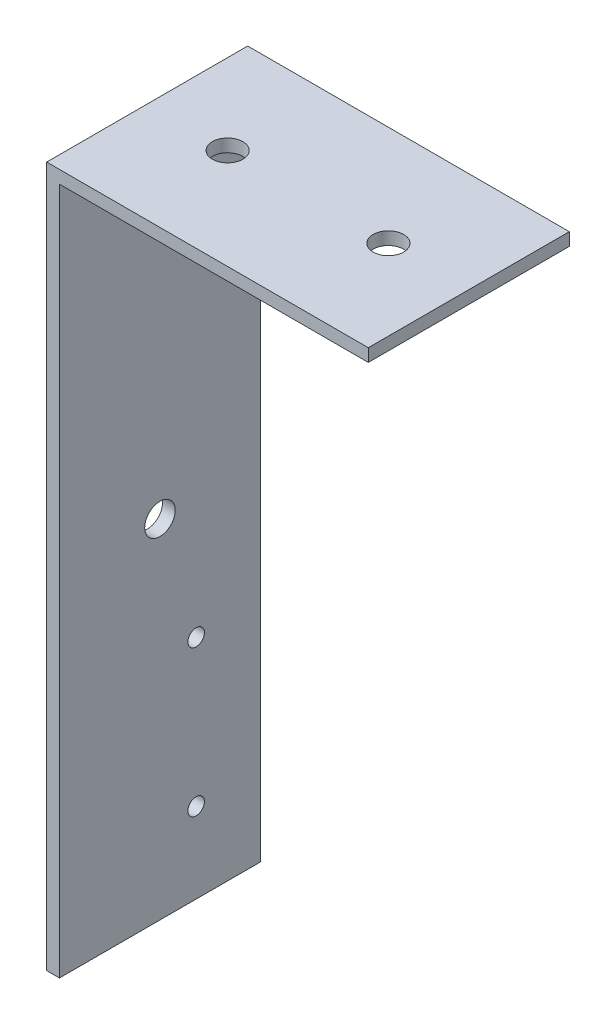
ISO-10303-21;
HEADER;
FILE_DESCRIPTION(('STEP AP214'),'2;1');
FILE_NAME('part.step','',(''),(''),'','','');
FILE_SCHEMA(('AUTOMOTIVE_DESIGN { 1 0 10303 214 1 1 1 1 }'));
ENDSEC;
DATA;
#1=APPLICATION_CONTEXT('core data for automotive mechanical design processes');
#2=APPLICATION_PROTOCOL_DEFINITION('international standard','automotive_design',2000,#1);
#3=PRODUCT_CONTEXT('',#1,'mechanical');
#4=PRODUCT('Part','Part','',(#3));
#5=PRODUCT_RELATED_PRODUCT_CATEGORY('part','',(#4));
#6=PRODUCT_DEFINITION_FORMATION('','',#4);
#7=PRODUCT_DEFINITION_CONTEXT('part definition',#1,'design');
#8=PRODUCT_DEFINITION('design','',#6,#7);
#9=PRODUCT_DEFINITION_SHAPE('','',#8);
#10=(LENGTH_UNIT() NAMED_UNIT(*) SI_UNIT(.MILLI.,.METRE.));
#11=(NAMED_UNIT(*) PLANE_ANGLE_UNIT() SI_UNIT($,.RADIAN.));
#12=(NAMED_UNIT(*) SI_UNIT($,.STERADIAN.) SOLID_ANGLE_UNIT());
#13=UNCERTAINTY_MEASURE_WITH_UNIT(LENGTH_MEASURE(1.E-05),#10,'distance_accuracy_value','');
#14=(GEOMETRIC_REPRESENTATION_CONTEXT(3) GLOBAL_UNCERTAINTY_ASSIGNED_CONTEXT((#13)) GLOBAL_UNIT_ASSIGNED_CONTEXT((#10,
#11,#12)) REPRESENTATION_CONTEXT('',''));
#15=CARTESIAN_POINT('',(0.,0.,0.));
#16=DIRECTION('',(0.,0.,1.));
#17=DIRECTION('',(1.,0.,0.));
#18=AXIS2_PLACEMENT_3D('',#15,#16,#17);
#19=CARTESIAN_POINT('',(0.,0.,25.));
#20=DIRECTION('',(0.,1.,0.));
#21=DIRECTION('',(0.,0.,1.));
#22=AXIS2_PLACEMENT_3D('',#19,#20,#21);
#23=PLANE('',#22);
#24=DIRECTION('',(1.,0.,0.));
#25=VECTOR('',#24,1.);
#26=CARTESIAN_POINT('',(0.,0.,0.));
#27=LINE('',#26,#25);
#28=CARTESIAN_POINT('',(0.,0.,0.));
#29=VERTEX_POINT('',#28);
#30=CARTESIAN_POINT('',(1.5875,0.,0.));
#31=VERTEX_POINT('',#30);
#32=EDGE_CURVE('E120',#29,#31,#27,.T.);
#33=ORIENTED_EDGE('',*,*,#32,.T.);
#34=DIRECTION('',(0.,0.,-1.));
#35=VECTOR('',#34,1.);
#36=CARTESIAN_POINT('',(1.5875,0.,25.));
#37=LINE('',#36,#35);
#38=CARTESIAN_POINT('',(1.5875,0.,25.));
#39=VERTEX_POINT('',#38);
#40=EDGE_CURVE('E11',#39,#31,#37,.T.);
#41=ORIENTED_EDGE('',*,*,#40,.F.);
#42=DIRECTION('',(1.,0.,0.));
#43=VECTOR('',#42,1.);
#44=CARTESIAN_POINT('',(0.,0.,25.));
#45=LINE('',#44,#43);
#46=CARTESIAN_POINT('',(0.,0.,25.));
#47=VERTEX_POINT('',#46);
#48=EDGE_CURVE('E131',#47,#39,#45,.T.);
#49=ORIENTED_EDGE('',*,*,#48,.F.);
#50=DIRECTION('',(0.,0.,-1.));
#51=VECTOR('',#50,1.);
#52=CARTESIAN_POINT('',(0.,0.,25.));
#53=LINE('',#52,#51);
#54=EDGE_CURVE('E116',#47,#29,#53,.T.);
#55=ORIENTED_EDGE('',*,*,#54,.T.);
#56=EDGE_LOOP('',(#33,#41,#49,#55));
#57=FACE_BOUND('',#56,.T.);
#58=ADVANCED_FACE('F35',(#57),#23,.F.);
#59=CARTESIAN_POINT('',(1.5875,0.,25.));
#60=DIRECTION('',(-1.,0.,0.));
#61=DIRECTION('',(0.,0.,1.));
#62=AXIS2_PLACEMENT_3D('',#59,#60,#61);
#63=PLANE('',#62);
#64=CARTESIAN_POINT('',(1.5875,43.2,12.5));
#65=DIRECTION('',(-1.,0.,0.));
#66=DIRECTION('',(0.,0.,1.));
#67=AXIS2_PLACEMENT_3D('',#64,#65,#66);
#68=CIRCLE('',#67,1.89864999999999);
#69=CARTESIAN_POINT('',(1.5875,43.2,14.39865));
#70=VERTEX_POINT('',#69);
#71=EDGE_CURVE('E264',#70,#70,#68,.T.);
#72=ORIENTED_EDGE('',*,*,#71,.T.);
#73=EDGE_LOOP('',(#72));
#74=FACE_BOUND('',#73,.T.);
#75=CARTESIAN_POINT('',(1.5875,10.,8.));
#76=DIRECTION('',(-1.,0.,0.));
#77=DIRECTION('',(0.,0.,1.));
#78=AXIS2_PLACEMENT_3D('',#75,#76,#77);
#79=CIRCLE('',#78,1.0287);
#80=CARTESIAN_POINT('',(1.5875,10.,9.0287));
#81=VERTEX_POINT('',#80);
#82=EDGE_CURVE('E38',#81,#81,#79,.T.);
#83=ORIENTED_EDGE('',*,*,#82,.T.);
#84=EDGE_LOOP('',(#83));
#85=FACE_BOUND('',#84,.T.);
#86=CARTESIAN_POINT('',(1.5875,28.2,8.));
#87=DIRECTION('',(-1.,0.,0.));
#88=DIRECTION('',(0.,0.,1.));
#89=AXIS2_PLACEMENT_3D('',#86,#87,#88);
#90=CIRCLE('',#89,1.0287);
#91=CARTESIAN_POINT('',(1.5875,28.2,9.0287));
#92=VERTEX_POINT('',#91);
#93=EDGE_CURVE('E274',#92,#92,#90,.T.);
#94=ORIENTED_EDGE('',*,*,#93,.T.);
#95=EDGE_LOOP('',(#94));
#96=FACE_BOUND('',#95,.T.);
#97=DIRECTION('',(0.,1.,0.));
#98=VECTOR('',#97,1.);
#99=CARTESIAN_POINT('',(1.5875,0.,0.));
#100=LINE('',#99,#98);
#101=CARTESIAN_POINT('',(1.5875,85.5125,0.));
#102=VERTEX_POINT('',#101);
#103=EDGE_CURVE('E123',#31,#102,#100,.T.);
#104=ORIENTED_EDGE('',*,*,#103,.T.);
#105=DIRECTION('',(0.,0.,-1.));
#106=VECTOR('',#105,1.);
#107=CARTESIAN_POINT('',(1.5875,85.5125,25.));
#108=LINE('',#107,#106);
#109=CARTESIAN_POINT('',(1.5875,85.5125,25.));
#110=VERTEX_POINT('',#109);
#111=EDGE_CURVE('E44',#110,#102,#108,.T.);
#112=ORIENTED_EDGE('',*,*,#111,.F.);
#113=DIRECTION('',(0.,1.,0.));
#114=VECTOR('',#113,1.);
#115=CARTESIAN_POINT('',(1.5875,0.,25.));
#116=LINE('',#115,#114);
#117=EDGE_CURVE('E89',#39,#110,#116,.T.);
#118=ORIENTED_EDGE('',*,*,#117,.F.);
#119=ORIENTED_EDGE('',*,*,#40,.T.);
#120=EDGE_LOOP('',(#104,#112,#118,#119));
#121=FACE_BOUND('',#120,.T.);
#122=ADVANCED_FACE('F160',(#74,#85,#96,#121),#63,.F.);
#123=CARTESIAN_POINT('',(1.5875,85.5125,25.));
#124=DIRECTION('',(0.,1.,0.));
#125=DIRECTION('',(0.,0.,1.));
#126=AXIS2_PLACEMENT_3D('',#123,#124,#125);
#127=PLANE('',#126);
#128=CARTESIAN_POINT('',(10.,85.5125,12.5));
#129=DIRECTION('',(0.,1.,0.));
#130=DIRECTION('',(0.,0.,1.));
#131=AXIS2_PLACEMENT_3D('',#128,#129,#130);
#132=CIRCLE('',#131,1.89864999999999);
#133=CARTESIAN_POINT('',(10.,85.5125,14.39865));
#134=VERTEX_POINT('',#133);
#135=EDGE_CURVE('E280',#134,#134,#132,.T.);
#136=ORIENTED_EDGE('',*,*,#135,.T.);
#137=EDGE_LOOP('',(#136));
#138=FACE_BOUND('',#137,.T.);
#139=CARTESIAN_POINT('',(30.,85.5125,12.5));
#140=DIRECTION('',(0.,1.,0.));
#141=DIRECTION('',(0.,0.,1.));
#142=AXIS2_PLACEMENT_3D('',#139,#140,#141);
#143=CIRCLE('',#142,1.89864999999999);
#144=CARTESIAN_POINT('',(30.,85.5125,14.39865));
#145=VERTEX_POINT('',#144);
#146=EDGE_CURVE('E124',#145,#145,#143,.T.);
#147=ORIENTED_EDGE('',*,*,#146,.T.);
#148=EDGE_LOOP('',(#147));
#149=FACE_BOUND('',#148,.T.);
#150=DIRECTION('',(1.,0.,0.));
#151=VECTOR('',#150,1.);
#152=CARTESIAN_POINT('',(1.5875,85.5125,0.));
#153=LINE('',#152,#151);
#154=CARTESIAN_POINT('',(40.,85.5125,0.));
#155=VERTEX_POINT('',#154);
#156=EDGE_CURVE('E126',#102,#155,#153,.T.);
#157=ORIENTED_EDGE('',*,*,#156,.T.);
#158=DIRECTION('',(0.,0.,-1.));
#159=VECTOR('',#158,1.);
#160=CARTESIAN_POINT('',(40.,85.5125,25.));
#161=LINE('',#160,#159);
#162=CARTESIAN_POINT('',(40.,85.5125,25.));
#163=VERTEX_POINT('',#162);
#164=EDGE_CURVE('E111',#163,#155,#161,.T.);
#165=ORIENTED_EDGE('',*,*,#164,.F.);
#166=DIRECTION('',(1.,0.,0.));
#167=VECTOR('',#166,1.);
#168=CARTESIAN_POINT('',(1.5875,85.5125,25.));
#169=LINE('',#168,#167);
#170=EDGE_CURVE('E102',#110,#163,#169,.T.);
#171=ORIENTED_EDGE('',*,*,#170,.F.);
#172=ORIENTED_EDGE('',*,*,#111,.T.);
#173=EDGE_LOOP('',(#157,#165,#171,#172));
#174=FACE_BOUND('',#173,.T.);
#175=ADVANCED_FACE('F138',(#138,#149,#174),#127,.F.);
#176=CARTESIAN_POINT('',(40.,87.1,25.));
#177=DIRECTION('',(-1.,0.,0.));
#178=DIRECTION('',(0.,0.,1.));
#179=AXIS2_PLACEMENT_3D('',#176,#177,#178);
#180=PLANE('',#179);
#181=DIRECTION('',(0.,1.,0.));
#182=VECTOR('',#181,1.);
#183=CARTESIAN_POINT('',(40.,87.1,0.));
#184=LINE('',#183,#182);
#185=CARTESIAN_POINT('',(40.,87.1,0.));
#186=VERTEX_POINT('',#185);
#187=EDGE_CURVE('E110',#155,#186,#184,.T.);
#188=ORIENTED_EDGE('',*,*,#187,.T.);
#189=DIRECTION('',(0.,0.,-1.));
#190=VECTOR('',#189,1.);
#191=CARTESIAN_POINT('',(40.,87.1,25.));
#192=LINE('',#191,#190);
#193=CARTESIAN_POINT('',(40.,87.1,25.));
#194=VERTEX_POINT('',#193);
#195=EDGE_CURVE('E107',#194,#186,#192,.T.);
#196=ORIENTED_EDGE('',*,*,#195,.F.);
#197=DIRECTION('',(0.,1.,0.));
#198=VECTOR('',#197,1.);
#199=CARTESIAN_POINT('',(40.,87.1,25.));
#200=LINE('',#199,#198);
#201=EDGE_CURVE('E96',#163,#194,#200,.T.);
#202=ORIENTED_EDGE('',*,*,#201,.F.);
#203=ORIENTED_EDGE('',*,*,#164,.T.);
#204=EDGE_LOOP('',(#188,#196,#202,#203));
#205=FACE_BOUND('',#204,.T.);
#206=ADVANCED_FACE('F108',(#205),#180,.F.);
#207=CARTESIAN_POINT('',(0.,87.1,25.));
#208=DIRECTION('',(0.,-1.,0.));
#209=DIRECTION('',(0.,0.,-1.));
#210=AXIS2_PLACEMENT_3D('',#207,#208,#209);
#211=PLANE('',#210);
#212=CARTESIAN_POINT('',(10.,87.1,12.5));
#213=DIRECTION('',(0.,1.,0.));
#214=DIRECTION('',(0.,0.,1.));
#215=AXIS2_PLACEMENT_3D('',#212,#213,#214);
#216=CIRCLE('',#215,1.89865);
#217=CARTESIAN_POINT('',(10.,87.1,14.39865));
#218=VERTEX_POINT('',#217);
#219=EDGE_CURVE('E277',#218,#218,#216,.T.);
#220=ORIENTED_EDGE('',*,*,#219,.F.);
#221=EDGE_LOOP('',(#220));
#222=FACE_BOUND('',#221,.T.);
#223=CARTESIAN_POINT('',(30.,87.1,12.5));
#224=DIRECTION('',(0.,1.,0.));
#225=DIRECTION('',(0.,0.,1.));
#226=AXIS2_PLACEMENT_3D('',#223,#224,#225);
#227=CIRCLE('',#226,1.89865);
#228=CARTESIAN_POINT('',(30.,87.1,14.39865));
#229=VERTEX_POINT('',#228);
#230=EDGE_CURVE('E283',#229,#229,#227,.T.);
#231=ORIENTED_EDGE('',*,*,#230,.F.);
#232=EDGE_LOOP('',(#231));
#233=FACE_BOUND('',#232,.T.);
#234=DIRECTION('',(-1.,0.,0.));
#235=VECTOR('',#234,1.);
#236=CARTESIAN_POINT('',(0.,87.1,0.));
#237=LINE('',#236,#235);
#238=CARTESIAN_POINT('',(0.,87.1,0.));
#239=VERTEX_POINT('',#238);
#240=EDGE_CURVE('E75',#186,#239,#237,.T.);
#241=ORIENTED_EDGE('',*,*,#240,.T.);
#242=DIRECTION('',(0.,0.,-1.));
#243=VECTOR('',#242,1.);
#244=CARTESIAN_POINT('',(0.,87.1,25.));
#245=LINE('',#244,#243);
#246=CARTESIAN_POINT('',(0.,87.1,25.));
#247=VERTEX_POINT('',#246);
#248=EDGE_CURVE('E112',#247,#239,#245,.T.);
#249=ORIENTED_EDGE('',*,*,#248,.F.);
#250=DIRECTION('',(-1.,0.,0.));
#251=VECTOR('',#250,1.);
#252=CARTESIAN_POINT('',(0.,87.1,25.));
#253=LINE('',#252,#251);
#254=EDGE_CURVE('E100',#194,#247,#253,.T.);
#255=ORIENTED_EDGE('',*,*,#254,.F.);
#256=ORIENTED_EDGE('',*,*,#195,.T.);
#257=EDGE_LOOP('',(#241,#249,#255,#256));
#258=FACE_BOUND('',#257,.T.);
#259=ADVANCED_FACE('F114',(#222,#233,#258),#211,.F.);
#260=CARTESIAN_POINT('',(0.,0.,25.));
#261=DIRECTION('',(1.,0.,0.));
#262=DIRECTION('',(0.,0.,-1.));
#263=AXIS2_PLACEMENT_3D('',#260,#261,#262);
#264=PLANE('',#263);
#265=CARTESIAN_POINT('',(0.,43.2,12.5));
#266=DIRECTION('',(-1.,0.,0.));
#267=DIRECTION('',(0.,0.,1.));
#268=AXIS2_PLACEMENT_3D('',#265,#266,#267);
#269=CIRCLE('',#268,1.89864999999999);
#270=CARTESIAN_POINT('',(0.,43.2,14.39865));
#271=VERTEX_POINT('',#270);
#272=EDGE_CURVE('E262',#271,#271,#269,.T.);
#273=ORIENTED_EDGE('',*,*,#272,.F.);
#274=EDGE_LOOP('',(#273));
#275=FACE_BOUND('',#274,.T.);
#276=CARTESIAN_POINT('',(0.,10.,8.));
#277=DIRECTION('',(-1.,0.,0.));
#278=DIRECTION('',(0.,0.,1.));
#279=AXIS2_PLACEMENT_3D('',#276,#277,#278);
#280=CIRCLE('',#279,1.0287);
#281=CARTESIAN_POINT('',(0.,10.,9.0287));
#282=VERTEX_POINT('',#281);
#283=EDGE_CURVE('E265',#282,#282,#280,.T.);
#284=ORIENTED_EDGE('',*,*,#283,.F.);
#285=EDGE_LOOP('',(#284));
#286=FACE_BOUND('',#285,.T.);
#287=CARTESIAN_POINT('',(0.,28.2,8.));
#288=DIRECTION('',(-1.,0.,0.));
#289=DIRECTION('',(0.,0.,1.));
#290=AXIS2_PLACEMENT_3D('',#287,#288,#289);
#291=CIRCLE('',#290,1.0287);
#292=CARTESIAN_POINT('',(0.,28.2,9.0287));
#293=VERTEX_POINT('',#292);
#294=EDGE_CURVE('E271',#293,#293,#291,.T.);
#295=ORIENTED_EDGE('',*,*,#294,.F.);
#296=EDGE_LOOP('',(#295));
#297=FACE_BOUND('',#296,.T.);
#298=DIRECTION('',(0.,-1.,0.));
#299=VECTOR('',#298,1.);
#300=CARTESIAN_POINT('',(0.,0.,0.));
#301=LINE('',#300,#299);
#302=EDGE_CURVE('E81',#239,#29,#301,.T.);
#303=ORIENTED_EDGE('',*,*,#302,.T.);
#304=ORIENTED_EDGE('',*,*,#54,.F.);
#305=DIRECTION('',(0.,-1.,0.));
#306=VECTOR('',#305,1.);
#307=CARTESIAN_POINT('',(0.,0.,25.));
#308=LINE('',#307,#306);
#309=EDGE_CURVE('E52',#247,#47,#308,.T.);
#310=ORIENTED_EDGE('',*,*,#309,.F.);
#311=ORIENTED_EDGE('',*,*,#248,.T.);
#312=EDGE_LOOP('',(#303,#304,#310,#311));
#313=FACE_BOUND('',#312,.T.);
#314=ADVANCED_FACE('F145',(#275,#286,#297,#313),#264,.F.);
#315=CARTESIAN_POINT('',(0.,0.,25.));
#316=DIRECTION('',(0.,0.,1.));
#317=DIRECTION('',(1.,0.,0.));
#318=AXIS2_PLACEMENT_3D('',#315,#316,#317);
#319=PLANE('',#318);
#320=ORIENTED_EDGE('',*,*,#48,.T.);
#321=ORIENTED_EDGE('',*,*,#117,.T.);
#322=ORIENTED_EDGE('',*,*,#170,.T.);
#323=ORIENTED_EDGE('',*,*,#201,.T.);
#324=ORIENTED_EDGE('',*,*,#254,.T.);
#325=ORIENTED_EDGE('',*,*,#309,.T.);
#326=EDGE_LOOP('',(#320,#321,#322,#323,#324,#325));
#327=FACE_BOUND('',#326,.T.);
#328=ADVANCED_FACE('F98',(#327),#319,.T.);
#329=CARTESIAN_POINT('',(0.,0.,0.));
#330=DIRECTION('',(0.,0.,1.));
#331=DIRECTION('',(1.,0.,0.));
#332=AXIS2_PLACEMENT_3D('',#329,#330,#331);
#333=PLANE('',#332);
#334=ORIENTED_EDGE('',*,*,#32,.F.);
#335=ORIENTED_EDGE('',*,*,#302,.F.);
#336=ORIENTED_EDGE('',*,*,#240,.F.);
#337=ORIENTED_EDGE('',*,*,#187,.F.);
#338=ORIENTED_EDGE('',*,*,#156,.F.);
#339=ORIENTED_EDGE('',*,*,#103,.F.);
#340=EDGE_LOOP('',(#334,#335,#336,#337,#338,#339));
#341=FACE_BOUND('',#340,.T.);
#342=ADVANCED_FACE('F141',(#341),#333,.F.);
#343=CARTESIAN_POINT('',(30.,87.1,12.5));
#344=DIRECTION('',(0.,1.,0.));
#345=DIRECTION('',(0.,0.,1.));
#346=AXIS2_PLACEMENT_3D('',#343,#344,#345);
#347=CYLINDRICAL_SURFACE('',#346,1.89864999999999);
#348=ORIENTED_EDGE('',*,*,#230,.T.);
#349=EDGE_LOOP('',(#348));
#350=FACE_BOUND('',#349,.T.);
#351=ORIENTED_EDGE('',*,*,#146,.F.);
#352=EDGE_LOOP('',(#351));
#353=FACE_BOUND('',#352,.T.);
#354=ADVANCED_FACE('F192',(#350,#353),#347,.F.);
#355=CARTESIAN_POINT('',(10.,87.1,12.5));
#356=DIRECTION('',(0.,1.,0.));
#357=DIRECTION('',(0.,0.,1.));
#358=AXIS2_PLACEMENT_3D('',#355,#356,#357);
#359=CYLINDRICAL_SURFACE('',#358,1.89864999999999);
#360=ORIENTED_EDGE('',*,*,#219,.T.);
#361=EDGE_LOOP('',(#360));
#362=FACE_BOUND('',#361,.T.);
#363=ORIENTED_EDGE('',*,*,#135,.F.);
#364=EDGE_LOOP('',(#363));
#365=FACE_BOUND('',#364,.T.);
#366=ADVANCED_FACE('F197',(#362,#365),#359,.F.);
#367=CARTESIAN_POINT('',(0.,28.2,8.));
#368=DIRECTION('',(-1.,0.,0.));
#369=DIRECTION('',(0.,0.,1.));
#370=AXIS2_PLACEMENT_3D('',#367,#368,#369);
#371=CYLINDRICAL_SURFACE('',#370,1.0287);
#372=ORIENTED_EDGE('',*,*,#294,.T.);
#373=EDGE_LOOP('',(#372));
#374=FACE_BOUND('',#373,.T.);
#375=ORIENTED_EDGE('',*,*,#93,.F.);
#376=EDGE_LOOP('',(#375));
#377=FACE_BOUND('',#376,.T.);
#378=ADVANCED_FACE('F209',(#374,#377),#371,.F.);
#379=CARTESIAN_POINT('',(0.,10.,8.));
#380=DIRECTION('',(-1.,0.,0.));
#381=DIRECTION('',(0.,0.,1.));
#382=AXIS2_PLACEMENT_3D('',#379,#380,#381);
#383=CYLINDRICAL_SURFACE('',#382,1.0287);
#384=ORIENTED_EDGE('',*,*,#283,.T.);
#385=EDGE_LOOP('',(#384));
#386=FACE_BOUND('',#385,.T.);
#387=ORIENTED_EDGE('',*,*,#82,.F.);
#388=EDGE_LOOP('',(#387));
#389=FACE_BOUND('',#388,.T.);
#390=ADVANCED_FACE('F219',(#386,#389),#383,.F.);
#391=CARTESIAN_POINT('',(0.,43.2,12.5));
#392=DIRECTION('',(-1.,0.,0.));
#393=DIRECTION('',(0.,0.,1.));
#394=AXIS2_PLACEMENT_3D('',#391,#392,#393);
#395=CYLINDRICAL_SURFACE('',#394,1.89864999999999);
#396=ORIENTED_EDGE('',*,*,#272,.T.);
#397=EDGE_LOOP('',(#396));
#398=FACE_BOUND('',#397,.T.);
#399=ORIENTED_EDGE('',*,*,#71,.F.);
#400=EDGE_LOOP('',(#399));
#401=FACE_BOUND('',#400,.T.);
#402=ADVANCED_FACE('F228',(#398,#401),#395,.F.);
#403=CLOSED_SHELL('',(#58,#122,#175,#206,#259,#314,#328,#342,#354,#366,#378,#390,#402));
#404=MANIFOLD_SOLID_BREP('B2',#403);
#405=ADVANCED_BREP_SHAPE_REPRESENTATION('',(#18,#404),#14);
#406=SHAPE_DEFINITION_REPRESENTATION(#9,#405);
ENDSEC;
END-ISO-10303-21;
